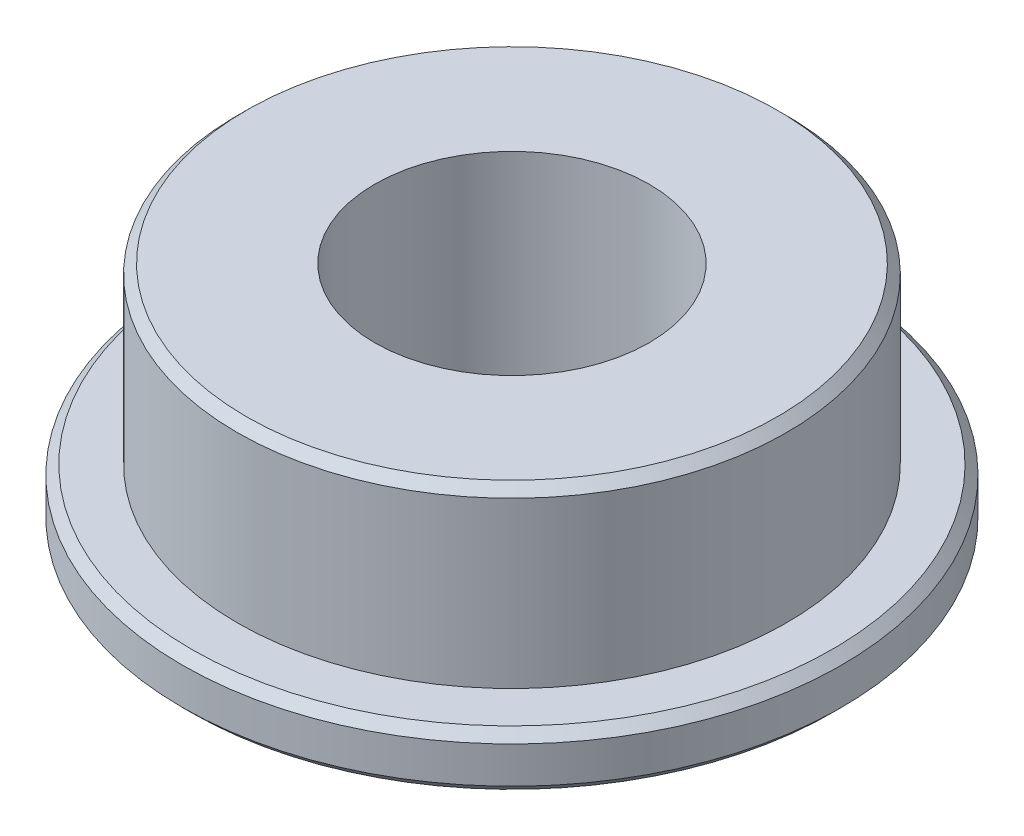
ISO-10303-21;
HEADER;
FILE_DESCRIPTION(('STEP AP214'),'2;1');
FILE_NAME('part.step','',(''),(''),'','','');
FILE_SCHEMA(('AUTOMOTIVE_DESIGN { 1 0 10303 214 1 1 1 1 }'));
ENDSEC;
DATA;
#1=APPLICATION_CONTEXT('core data for automotive mechanical design processes');
#2=APPLICATION_PROTOCOL_DEFINITION('international standard','automotive_design',2000,#1);
#3=PRODUCT_CONTEXT('',#1,'mechanical');
#4=PRODUCT('Part','Part','',(#3));
#5=PRODUCT_RELATED_PRODUCT_CATEGORY('part','',(#4));
#6=PRODUCT_DEFINITION_FORMATION('','',#4);
#7=PRODUCT_DEFINITION_CONTEXT('part definition',#1,'design');
#8=PRODUCT_DEFINITION('design','',#6,#7);
#9=PRODUCT_DEFINITION_SHAPE('','',#8);
#10=(LENGTH_UNIT() NAMED_UNIT(*) SI_UNIT(.MILLI.,.METRE.));
#11=(NAMED_UNIT(*) PLANE_ANGLE_UNIT() SI_UNIT($,.RADIAN.));
#12=(NAMED_UNIT(*) SI_UNIT($,.STERADIAN.) SOLID_ANGLE_UNIT());
#13=UNCERTAINTY_MEASURE_WITH_UNIT(LENGTH_MEASURE(1.E-05),#10,'distance_accuracy_value','');
#14=(GEOMETRIC_REPRESENTATION_CONTEXT(3) GLOBAL_UNCERTAINTY_ASSIGNED_CONTEXT((#13)) GLOBAL_UNIT_ASSIGNED_CONTEXT((#10,
#11,#12)) REPRESENTATION_CONTEXT('',''));
#15=CARTESIAN_POINT('',(0.,0.,0.));
#16=DIRECTION('',(0.,0.,1.));
#17=DIRECTION('',(1.,0.,0.));
#18=AXIS2_PLACEMENT_3D('',#15,#16,#17);
#19=CARTESIAN_POINT('',(0.,2.5,0.));
#20=DIRECTION('',(0.,1.,0.));
#21=DIRECTION('',(0.,0.,1.));
#22=AXIS2_PLACEMENT_3D('',#19,#20,#21);
#23=PLANE('',#22);
#24=CARTESIAN_POINT('',(0.,2.5,0.));
#25=DIRECTION('',(0.,1.,0.));
#26=DIRECTION('',(0.,0.,1.));
#27=AXIS2_PLACEMENT_3D('',#24,#25,#26);
#28=CIRCLE('',#27,2.90000000000001);
#29=CARTESIAN_POINT('',(0.,2.5,2.90000000000001));
#30=VERTEX_POINT('',#29);
#31=EDGE_CURVE('E49',#30,#30,#28,.T.);
#32=ORIENTED_EDGE('',*,*,#31,.T.);
#33=EDGE_LOOP('',(#32));
#34=FACE_BOUND('',#33,.T.);
#35=CARTESIAN_POINT('',(0.,2.5,0.));
#36=DIRECTION('',(0.,1.,0.));
#37=DIRECTION('',(0.,0.,1.));
#38=AXIS2_PLACEMENT_3D('',#35,#36,#37);
#39=CIRCLE('',#38,1.5);
#40=CARTESIAN_POINT('',(0.,2.5,1.5));
#41=VERTEX_POINT('',#40);
#42=EDGE_CURVE('E68',#41,#41,#39,.T.);
#43=ORIENTED_EDGE('',*,*,#42,.F.);
#44=EDGE_LOOP('',(#43));
#45=FACE_BOUND('',#44,.T.);
#46=ADVANCED_FACE('F41',(#34,#45),#23,.T.);
#47=CARTESIAN_POINT('',(0.,2.5,0.));
#48=DIRECTION('',(0.,-1.,0.));
#49=DIRECTION('',(0.,0.,-1.));
#50=AXIS2_PLACEMENT_3D('',#47,#48,#49);
#51=CYLINDRICAL_SURFACE('',#50,3.6);
#52=CARTESIAN_POINT('',(0.,0.0999999999999998,0.));
#53=DIRECTION('',(0.,1.,0.));
#54=DIRECTION('',(0.,0.,1.));
#55=AXIS2_PLACEMENT_3D('',#52,#53,#54);
#56=CIRCLE('',#55,3.6);
#57=CARTESIAN_POINT('',(0.,0.0999999999999998,3.6));
#58=VERTEX_POINT('',#57);
#59=EDGE_CURVE('E62',#58,#58,#56,.T.);
#60=ORIENTED_EDGE('',*,*,#59,.T.);
#61=EDGE_LOOP('',(#60));
#62=FACE_BOUND('',#61,.T.);
#63=CARTESIAN_POINT('',(0.,0.499999999999999,0.));
#64=DIRECTION('',(0.,1.,0.));
#65=DIRECTION('',(0.,0.,1.));
#66=AXIS2_PLACEMENT_3D('',#63,#64,#65);
#67=CIRCLE('',#66,3.6);
#68=CARTESIAN_POINT('',(0.,0.499999999999999,3.6));
#69=VERTEX_POINT('',#68);
#70=EDGE_CURVE('E65',#69,#69,#67,.F.);
#71=ORIENTED_EDGE('',*,*,#70,.T.);
#72=EDGE_LOOP('',(#71));
#73=FACE_BOUND('',#72,.T.);
#74=ADVANCED_FACE('F96',(#62,#73),#51,.T.);
#75=CARTESIAN_POINT('',(0.,0.,0.));
#76=DIRECTION('',(0.,1.,0.));
#77=DIRECTION('',(0.,0.,1.));
#78=AXIS2_PLACEMENT_3D('',#75,#76,#77);
#79=PLANE('',#78);
#80=CARTESIAN_POINT('',(0.,0.,0.));
#81=DIRECTION('',(0.,1.,0.));
#82=DIRECTION('',(0.,0.,1.));
#83=AXIS2_PLACEMENT_3D('',#80,#81,#82);
#84=CIRCLE('',#83,3.5);
#85=CARTESIAN_POINT('',(0.,0.,3.5));
#86=VERTEX_POINT('',#85);
#87=EDGE_CURVE('E57',#86,#86,#84,.F.);
#88=ORIENTED_EDGE('',*,*,#87,.T.);
#89=EDGE_LOOP('',(#88));
#90=FACE_BOUND('',#89,.T.);
#91=CARTESIAN_POINT('',(0.,0.,0.));
#92=DIRECTION('',(0.,1.,0.));
#93=DIRECTION('',(0.,0.,1.));
#94=AXIS2_PLACEMENT_3D('',#91,#92,#93);
#95=CIRCLE('',#94,1.5);
#96=CARTESIAN_POINT('',(0.,0.,1.5));
#97=VERTEX_POINT('',#96);
#98=EDGE_CURVE('E69',#97,#97,#95,.T.);
#99=ORIENTED_EDGE('',*,*,#98,.T.);
#100=EDGE_LOOP('',(#99));
#101=FACE_BOUND('',#100,.T.);
#102=ADVANCED_FACE('F92',(#90,#101),#79,.F.);
#103=CARTESIAN_POINT('',(0.,2.5,0.));
#104=DIRECTION('',(0.,-1.,0.));
#105=DIRECTION('',(0.,0.,-1.));
#106=AXIS2_PLACEMENT_3D('',#103,#104,#105);
#107=CYLINDRICAL_SURFACE('',#106,1.5);
#108=ORIENTED_EDGE('',*,*,#42,.T.);
#109=EDGE_LOOP('',(#108));
#110=FACE_BOUND('',#109,.T.);
#111=ORIENTED_EDGE('',*,*,#98,.F.);
#112=EDGE_LOOP('',(#111));
#113=FACE_BOUND('',#112,.T.);
#114=ADVANCED_FACE('F82',(#110,#113),#107,.F.);
#115=CARTESIAN_POINT('',(0.,0.6,0.));
#116=DIRECTION('',(0.,1.,0.));
#117=DIRECTION('',(0.,0.,1.));
#118=AXIS2_PLACEMENT_3D('',#115,#116,#117);
#119=PLANE('',#118);
#120=CARTESIAN_POINT('',(0.,0.6,0.));
#121=DIRECTION('',(0.,1.,0.));
#122=DIRECTION('',(0.,0.,1.));
#123=AXIS2_PLACEMENT_3D('',#120,#121,#122);
#124=CIRCLE('',#123,3.5);
#125=CARTESIAN_POINT('',(0.,0.6,3.5));
#126=VERTEX_POINT('',#125);
#127=EDGE_CURVE('E53',#126,#126,#124,.T.);
#128=ORIENTED_EDGE('',*,*,#127,.T.);
#129=EDGE_LOOP('',(#128));
#130=FACE_BOUND('',#129,.T.);
#131=CARTESIAN_POINT('',(0.,0.6,0.));
#132=DIRECTION('',(0.,1.,0.));
#133=DIRECTION('',(0.,0.,1.));
#134=AXIS2_PLACEMENT_3D('',#131,#132,#133);
#135=CIRCLE('',#134,3.);
#136=CARTESIAN_POINT('',(0.,0.6,3.));
#137=VERTEX_POINT('',#136);
#138=EDGE_CURVE('E72',#137,#137,#135,.T.);
#139=ORIENTED_EDGE('',*,*,#138,.F.);
#140=EDGE_LOOP('',(#139));
#141=FACE_BOUND('',#140,.T.);
#142=ADVANCED_FACE('F80',(#130,#141),#119,.T.);
#143=CARTESIAN_POINT('',(0.,0.6,0.));
#144=DIRECTION('',(0.,1.,0.));
#145=DIRECTION('',(0.,0.,1.));
#146=AXIS2_PLACEMENT_3D('',#143,#144,#145);
#147=CYLINDRICAL_SURFACE('',#146,3.);
#148=CARTESIAN_POINT('',(0.,2.4,0.));
#149=DIRECTION('',(0.,1.,0.));
#150=DIRECTION('',(0.,0.,1.));
#151=AXIS2_PLACEMENT_3D('',#148,#149,#150);
#152=CIRCLE('',#151,3.);
#153=CARTESIAN_POINT('',(0.,2.4,3.));
#154=VERTEX_POINT('',#153);
#155=EDGE_CURVE('E10',#154,#154,#152,.F.);
#156=CARTESIAN_POINT('',(0.,2.4,3.));
#157=CARTESIAN_POINT('',(0.,2.38125,3.));
#158=CARTESIAN_POINT('',(0.,2.3625,3.));
#159=CARTESIAN_POINT('',(0.,2.325,3.));
#160=CARTESIAN_POINT('',(0.,2.30625,3.));
#161=CARTESIAN_POINT('',(0.,2.26875,3.));
#162=CARTESIAN_POINT('',(0.,2.25,3.));
#163=CARTESIAN_POINT('',(0.,2.2125,3.));
#164=CARTESIAN_POINT('',(0.,2.19375,3.));
#165=CARTESIAN_POINT('',(0.,2.15625,3.));
#166=CARTESIAN_POINT('',(0.,2.1375,3.));
#167=CARTESIAN_POINT('',(0.,2.1,3.));
#168=CARTESIAN_POINT('',(0.,2.08125,3.));
#169=CARTESIAN_POINT('',(0.,2.04375,3.));
#170=CARTESIAN_POINT('',(0.,2.025,3.));
#171=CARTESIAN_POINT('',(0.,1.9875,3.));
#172=CARTESIAN_POINT('',(0.,1.96875,3.));
#173=CARTESIAN_POINT('',(0.,1.93125,3.));
#174=CARTESIAN_POINT('',(0.,1.9125,3.));
#175=CARTESIAN_POINT('',(0.,1.875,3.));
#176=CARTESIAN_POINT('',(0.,1.85625,3.));
#177=CARTESIAN_POINT('',(0.,1.81875,3.));
#178=CARTESIAN_POINT('',(0.,1.8,3.));
#179=CARTESIAN_POINT('',(0.,1.7625,3.));
#180=CARTESIAN_POINT('',(0.,1.74375,3.));
#181=CARTESIAN_POINT('',(0.,1.70625,3.));
#182=CARTESIAN_POINT('',(0.,1.6875,3.));
#183=CARTESIAN_POINT('',(0.,1.65,3.));
#184=CARTESIAN_POINT('',(0.,1.63125,3.));
#185=CARTESIAN_POINT('',(0.,1.59375,3.));
#186=CARTESIAN_POINT('',(0.,1.575,3.));
#187=CARTESIAN_POINT('',(0.,1.5375,3.));
#188=CARTESIAN_POINT('',(0.,1.51875,3.));
#189=CARTESIAN_POINT('',(0.,1.48125,3.));
#190=CARTESIAN_POINT('',(0.,1.4625,3.));
#191=CARTESIAN_POINT('',(0.,1.425,3.));
#192=CARTESIAN_POINT('',(0.,1.40625,3.));
#193=CARTESIAN_POINT('',(0.,1.36875,3.));
#194=CARTESIAN_POINT('',(0.,1.35,3.));
#195=CARTESIAN_POINT('',(0.,1.3125,3.));
#196=CARTESIAN_POINT('',(0.,1.29375,3.));
#197=CARTESIAN_POINT('',(0.,1.25625,3.));
#198=CARTESIAN_POINT('',(0.,1.2375,3.));
#199=CARTESIAN_POINT('',(0.,1.2,3.));
#200=CARTESIAN_POINT('',(0.,1.18125,3.));
#201=CARTESIAN_POINT('',(0.,1.14375,3.));
#202=CARTESIAN_POINT('',(0.,1.125,3.));
#203=CARTESIAN_POINT('',(0.,1.0875,3.));
#204=CARTESIAN_POINT('',(0.,1.06875,3.));
#205=CARTESIAN_POINT('',(0.,1.03125,3.));
#206=CARTESIAN_POINT('',(0.,1.0125,3.));
#207=CARTESIAN_POINT('',(0.,0.975000000000001,3.));
#208=CARTESIAN_POINT('',(0.,0.956250000000001,3.));
#209=CARTESIAN_POINT('',(0.,0.918750000000001,3.));
#210=CARTESIAN_POINT('',(0.,0.900000000000001,3.));
#211=CARTESIAN_POINT('',(0.,0.862500000000001,3.));
#212=CARTESIAN_POINT('',(0.,0.843750000000001,3.));
#213=CARTESIAN_POINT('',(0.,0.806250000000001,3.));
#214=CARTESIAN_POINT('',(0.,0.787500000000001,3.));
#215=CARTESIAN_POINT('',(0.,0.750000000000001,3.));
#216=CARTESIAN_POINT('',(0.,0.73125,3.));
#217=CARTESIAN_POINT('',(0.,0.69375,3.));
#218=CARTESIAN_POINT('',(0.,0.675,3.));
#219=CARTESIAN_POINT('',(0.,0.6375,3.));
#220=CARTESIAN_POINT('',(0.,0.61875,3.));
#221=CARTESIAN_POINT('',(0.,0.6,3.));
#222=B_SPLINE_CURVE_WITH_KNOTS('',3,(#156,#157,#158,#159,#160,#161,#162,#163,#164,#165,#166,
#167,#168,#169,#170,#171,#172,#173,#174,#175,#176,#177,#178,#179,#180,#181,#182,#183,#184,#185,
#186,#187,#188,#189,#190,#191,#192,#193,#194,#195,#196,#197,#198,#199,#200,#201,#202,#203,#204,
#205,#206,#207,#208,#209,#210,#211,#212,#213,#214,#215,#216,#217,#218,#219,#220,#221),
.UNSPECIFIED.,.F.,.F.,(4,2,2,2,2,2,2,2,2,2,2,2,2,2,2,2,2,2,2,2,2,2,2,2,2,2,2,2,2,2,2,2,4),(0.,
0.0562500000000003,0.1125,0.168750000000001,0.225000000000001,0.281250000000001,
0.337500000000001,0.393750000000001,0.450000000000001,0.506250000000002,0.562500000000002,
0.618750000000002,0.675000000000002,0.731250000000002,0.787500000000002,0.843750000000002,
0.900000000000002,0.956250000000003,1.0125,1.06875,1.125,1.18125,1.2375,1.29375,1.35,1.40625,
1.4625,1.51875,1.575,1.63125,1.6875,1.74375,1.8),.UNSPECIFIED.);
#223=EDGE_CURVE('BSEAM78',#154,#137,#222,.T.);
#224=ORIENTED_EDGE('',*,*,#155,.T.);
#225=ORIENTED_EDGE('',*,*,#138,.T.);
#226=ORIENTED_EDGE('',*,*,#223,.T.);
#227=ORIENTED_EDGE('',*,*,#223,.F.);
#228=EDGE_LOOP('',(#224,#226,#225,#227));
#229=FACE_BOUND('',#228,.T.);
#230=ADVANCED_FACE('F78',(#229),#147,.T.);
#231=CARTESIAN_POINT('',(0.,0.0999999999999998,0.));
#232=DIRECTION('',(0.,1.,0.));
#233=DIRECTION('',(0.,0.,1.));
#234=AXIS2_PLACEMENT_3D('',#231,#232,#233);
#235=CONICAL_SURFACE('',#234,3.6,0.78539816339745);
#236=CARTESIAN_POINT('',(0.,0.,3.5));
#237=CARTESIAN_POINT('',(0.,0.0010416666666667,3.50104166666667));
#238=CARTESIAN_POINT('',(0.,0.00208333333333334,3.50208333333333));
#239=CARTESIAN_POINT('',(0.,0.00416666666666662,3.50416666666667));
#240=CARTESIAN_POINT('',(0.,0.00520833333333326,3.50520833333333));
#241=CARTESIAN_POINT('',(0.,0.00729166666666662,3.50729166666667));
#242=CARTESIAN_POINT('',(0.,0.00833333333333333,3.50833333333333));
#243=CARTESIAN_POINT('',(0.,0.0104166666666667,3.51041666666667));
#244=CARTESIAN_POINT('',(0.,0.0114583333333333,3.51145833333333));
#245=CARTESIAN_POINT('',(0.,0.0135416666666666,3.51354166666667));
#246=CARTESIAN_POINT('',(0.,0.0145833333333333,3.51458333333333));
#247=CARTESIAN_POINT('',(0.,0.0166666666666666,3.51666666666667));
#248=CARTESIAN_POINT('',(0.,0.0177083333333333,3.51770833333333));
#249=CARTESIAN_POINT('',(0.,0.0197916666666666,3.51979166666667));
#250=CARTESIAN_POINT('',(0.,0.0208333333333332,3.52083333333333));
#251=CARTESIAN_POINT('',(0.,0.0229166666666666,3.52291666666667));
#252=CARTESIAN_POINT('',(0.,0.0239583333333333,3.52395833333333));
#253=CARTESIAN_POINT('',(0.,0.0260416666666667,3.52604166666667));
#254=CARTESIAN_POINT('',(0.,0.0270833333333333,3.52708333333333));
#255=CARTESIAN_POINT('',(0.,0.0291666666666666,3.52916666666667));
#256=CARTESIAN_POINT('',(0.,0.0302083333333333,3.53020833333333));
#257=CARTESIAN_POINT('',(0.,0.0322916666666666,3.53229166666667));
#258=CARTESIAN_POINT('',(0.,0.0333333333333333,3.53333333333333));
#259=CARTESIAN_POINT('',(0.,0.0354166666666666,3.53541666666667));
#260=CARTESIAN_POINT('',(0.,0.0364583333333333,3.53645833333333));
#261=CARTESIAN_POINT('',(0.,0.0385416666666666,3.53854166666667));
#262=CARTESIAN_POINT('',(0.,0.0395833333333332,3.53958333333333));
#263=CARTESIAN_POINT('',(0.,0.0416666666666666,3.54166666666667));
#264=CARTESIAN_POINT('',(0.,0.0427083333333333,3.54270833333333));
#265=CARTESIAN_POINT('',(0.,0.0447916666666666,3.54479166666667));
#266=CARTESIAN_POINT('',(0.,0.0458333333333333,3.54583333333333));
#267=CARTESIAN_POINT('',(0.,0.0479166666666666,3.54791666666667));
#268=CARTESIAN_POINT('',(0.,0.0489583333333332,3.54895833333333));
#269=CARTESIAN_POINT('',(0.,0.0510416666666666,3.55104166666667));
#270=CARTESIAN_POINT('',(0.,0.0520833333333332,3.55208333333333));
#271=CARTESIAN_POINT('',(0.,0.0541666666666666,3.55416666666667));
#272=CARTESIAN_POINT('',(0.,0.0552083333333332,3.55520833333333));
#273=CARTESIAN_POINT('',(0.,0.0572916666666665,3.55729166666667));
#274=CARTESIAN_POINT('',(0.,0.0583333333333332,3.55833333333333));
#275=CARTESIAN_POINT('',(0.,0.0604166666666666,3.56041666666667));
#276=CARTESIAN_POINT('',(0.,0.0614583333333332,3.56145833333333));
#277=CARTESIAN_POINT('',(0.,0.0635416666666665,3.56354166666667));
#278=CARTESIAN_POINT('',(0.,0.0645833333333332,3.56458333333333));
#279=CARTESIAN_POINT('',(0.,0.0666666666666666,3.56666666666667));
#280=CARTESIAN_POINT('',(0.,0.0677083333333332,3.56770833333333));
#281=CARTESIAN_POINT('',(0.,0.0697916666666665,3.56979166666667));
#282=CARTESIAN_POINT('',(0.,0.0708333333333332,3.57083333333333));
#283=CARTESIAN_POINT('',(0.,0.0729166666666665,3.57291666666667));
#284=CARTESIAN_POINT('',(0.,0.0739583333333332,3.57395833333333));
#285=CARTESIAN_POINT('',(0.,0.0760416666666666,3.57604166666667));
#286=CARTESIAN_POINT('',(0.,0.0770833333333332,3.57708333333333));
#287=CARTESIAN_POINT('',(0.,0.0791666666666665,3.57916666666667));
#288=CARTESIAN_POINT('',(0.,0.0802083333333332,3.58020833333333));
#289=CARTESIAN_POINT('',(0.,0.0822916666666665,3.58229166666667));
#290=CARTESIAN_POINT('',(0.,0.0833333333333332,3.58333333333333));
#291=CARTESIAN_POINT('',(0.,0.0854166666666665,3.58541666666667));
#292=CARTESIAN_POINT('',(0.,0.0864583333333332,3.58645833333333));
#293=CARTESIAN_POINT('',(0.,0.0885416666666665,3.58854166666667));
#294=CARTESIAN_POINT('',(0.,0.0895833333333331,3.58958333333333));
#295=CARTESIAN_POINT('',(0.,0.0916666666666665,3.59166666666667));
#296=CARTESIAN_POINT('',(0.,0.0927083333333332,3.59270833333333));
#297=CARTESIAN_POINT('',(0.,0.0947916666666665,3.59479166666667));
#298=CARTESIAN_POINT('',(0.,0.0958333333333332,3.59583333333333));
#299=CARTESIAN_POINT('',(0.,0.0979166666666665,3.59791666666667));
#300=CARTESIAN_POINT('',(0.,0.0989583333333331,3.59895833333333));
#301=CARTESIAN_POINT('',(0.,0.0999999999999998,3.6));
#302=B_SPLINE_CURVE_WITH_KNOTS('',3,(#236,#237,#238,#239,#240,#241,#242,#243,#244,#245,#246,
#247,#248,#249,#250,#251,#252,#253,#254,#255,#256,#257,#258,#259,#260,#261,#262,#263,#264,#265,
#266,#267,#268,#269,#270,#271,#272,#273,#274,#275,#276,#277,#278,#279,#280,#281,#282,#283,#284,
#285,#286,#287,#288,#289,#290,#291,#292,#293,#294,#295,#296,#297,#298,#299,#300,#301),
.UNSPECIFIED.,.F.,.F.,(4,2,2,2,2,2,2,2,2,2,2,2,2,2,2,2,2,2,2,2,2,2,2,2,2,2,2,2,2,2,2,2,4),(0.,
0.00441941738241598,0.00883883476483196,0.0132582521472476,0.0176776695296636,
0.0220970869120796,0.0265165042944956,0.0309359216769116,0.0353553390593272,0.0397747564417432,
0.0441941738241592,0.0486135912065752,0.0530330085889912,0.0574524259714071,0.0618718433538228,
0.0662912607362388,0.0707106781186548,0.0751300955010708,0.0795495128834867,0.0839689302659024,
0.0883883476483184,0.0928077650307344,0.0972271824131504,0.101646599795566,0.106066017177982,
0.110485434560398,0.114904851942814,0.11932426932523,0.123743686707646,0.128163104090062,
0.132582521472478,0.137001938854894,0.14142135623731),.UNSPECIFIED.);
#303=EDGE_CURVE('BSEAM89',#86,#58,#302,.T.);
#304=ORIENTED_EDGE('',*,*,#87,.F.);
#305=ORIENTED_EDGE('',*,*,#59,.F.);
#306=ORIENTED_EDGE('',*,*,#303,.T.);
#307=ORIENTED_EDGE('',*,*,#303,.F.);
#308=EDGE_LOOP('',(#304,#306,#305,#307));
#309=FACE_BOUND('',#308,.T.);
#310=ADVANCED_FACE('F89',(#309),#235,.T.);
#311=CARTESIAN_POINT('',(0.,0.6,0.));
#312=DIRECTION('',(0.,-1.,0.));
#313=DIRECTION('',(0.,0.,-1.));
#314=AXIS2_PLACEMENT_3D('',#311,#312,#313);
#315=CONICAL_SURFACE('',#314,3.5,0.785398163397441);
#316=ORIENTED_EDGE('',*,*,#70,.F.);
#317=EDGE_LOOP('',(#316));
#318=FACE_BOUND('',#317,.T.);
#319=ORIENTED_EDGE('',*,*,#127,.F.);
#320=EDGE_LOOP('',(#319));
#321=FACE_BOUND('',#320,.T.);
#322=ADVANCED_FACE('F112',(#318,#321),#315,.T.);
#323=CARTESIAN_POINT('',(0.,2.5,0.));
#324=DIRECTION('',(0.,-1.,0.));
#325=DIRECTION('',(0.,0.,-1.));
#326=AXIS2_PLACEMENT_3D('',#323,#324,#325);
#327=CONICAL_SURFACE('',#326,2.90000000000001,0.785398163397448);
#328=ORIENTED_EDGE('',*,*,#155,.F.);
#329=EDGE_LOOP('',(#328));
#330=FACE_BOUND('',#329,.T.);
#331=ORIENTED_EDGE('',*,*,#31,.F.);
#332=EDGE_LOOP('',(#331));
#333=FACE_BOUND('',#332,.T.);
#334=ADVANCED_FACE('F44',(#330,#333),#327,.T.);
#335=CLOSED_SHELL('',(#46,#74,#102,#114,#142,#230,#310,#322,#334));
#336=MANIFOLD_SOLID_BREP('B2',#335);
#337=ADVANCED_BREP_SHAPE_REPRESENTATION('',(#18,#336),#14);
#338=SHAPE_DEFINITION_REPRESENTATION(#9,#337);
ENDSEC;
END-ISO-10303-21;
